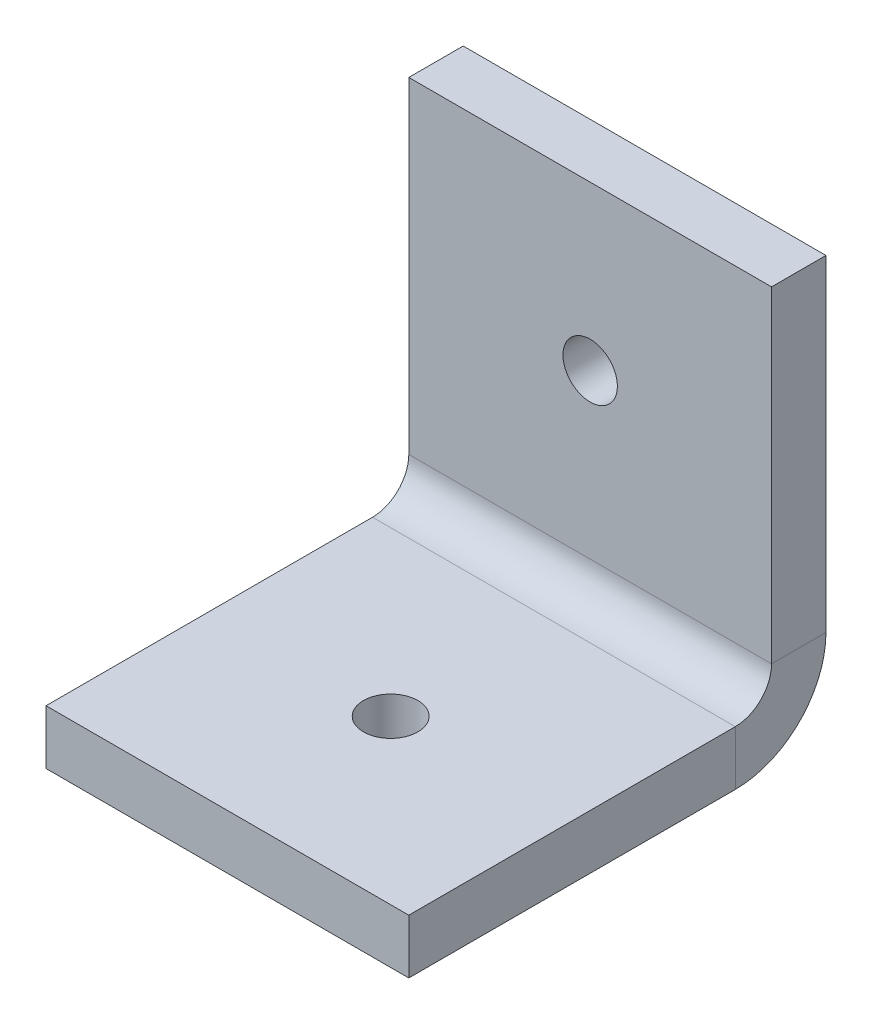
ISO-10303-21;
HEADER;
FILE_DESCRIPTION(('STEP AP214'),'2;1');
FILE_NAME('part.step','',(''),(''),'','','');
FILE_SCHEMA(('AUTOMOTIVE_DESIGN { 1 0 10303 214 1 1 1 1 }'));
ENDSEC;
DATA;
#1=APPLICATION_CONTEXT('core data for automotive mechanical design processes');
#2=APPLICATION_PROTOCOL_DEFINITION('international standard','automotive_design',2000,#1);
#3=PRODUCT_CONTEXT('',#1,'mechanical');
#4=PRODUCT('Part','Part','',(#3));
#5=PRODUCT_RELATED_PRODUCT_CATEGORY('part','',(#4));
#6=PRODUCT_DEFINITION_FORMATION('','',#4);
#7=PRODUCT_DEFINITION_CONTEXT('part definition',#1,'design');
#8=PRODUCT_DEFINITION('design','',#6,#7);
#9=PRODUCT_DEFINITION_SHAPE('','',#8);
#10=(LENGTH_UNIT() NAMED_UNIT(*) SI_UNIT(.MILLI.,.METRE.));
#11=(NAMED_UNIT(*) PLANE_ANGLE_UNIT() SI_UNIT($,.RADIAN.));
#12=(NAMED_UNIT(*) SI_UNIT($,.STERADIAN.) SOLID_ANGLE_UNIT());
#13=UNCERTAINTY_MEASURE_WITH_UNIT(LENGTH_MEASURE(1.E-05),#10,'distance_accuracy_value','');
#14=(GEOMETRIC_REPRESENTATION_CONTEXT(3) GLOBAL_UNCERTAINTY_ASSIGNED_CONTEXT((#13)) GLOBAL_UNIT_ASSIGNED_CONTEXT((#10,
#11,#12)) REPRESENTATION_CONTEXT('',''));
#15=CARTESIAN_POINT('',(0.,0.,0.));
#16=DIRECTION('',(0.,0.,1.));
#17=DIRECTION('',(1.,0.,0.));
#18=AXIS2_PLACEMENT_3D('',#15,#16,#17);
#19=CARTESIAN_POINT('',(20.,2.,0.));
#20=DIRECTION('',(1.,0.,0.));
#21=DIRECTION('',(0.,0.,-1.));
#22=AXIS2_PLACEMENT_3D('',#19,#20,#21);
#23=PLANE('',#22);
#24=DIRECTION('',(0.,0.,-1.));
#25=VECTOR('',#24,1.);
#26=CARTESIAN_POINT('',(20.,2.,0.));
#27=LINE('',#26,#25);
#28=CARTESIAN_POINT('',(20.,2.,0.));
#29=VERTEX_POINT('',#28);
#30=CARTESIAN_POINT('',(20.,2.,-3.));
#31=VERTEX_POINT('',#30);
#32=EDGE_CURVE('E11',#29,#31,#27,.T.);
#33=ORIENTED_EDGE('',*,*,#32,.F.);
#34=CARTESIAN_POINT('',(20.,2.,2.));
#35=DIRECTION('',(1.,0.,0.));
#36=DIRECTION('',(0.,0.,-1.));
#37=AXIS2_PLACEMENT_3D('',#34,#35,#36);
#38=CIRCLE('',#37,2.);
#39=CARTESIAN_POINT('',(20.,0.,2.));
#40=VERTEX_POINT('',#39);
#41=EDGE_CURVE('E129',#29,#40,#38,.F.);
#42=ORIENTED_EDGE('',*,*,#41,.T.);
#43=DIRECTION('',(0.,1.,0.));
#44=VECTOR('',#43,1.);
#45=CARTESIAN_POINT('',(20.,-3.,2.));
#46=LINE('',#45,#44);
#47=CARTESIAN_POINT('',(20.,-3.,2.));
#48=VERTEX_POINT('',#47);
#49=EDGE_CURVE('E47',#48,#40,#46,.T.);
#50=ORIENTED_EDGE('',*,*,#49,.F.);
#51=CARTESIAN_POINT('',(20.,2.,2.));
#52=DIRECTION('',(1.,0.,0.));
#53=DIRECTION('',(0.,0.,-1.));
#54=AXIS2_PLACEMENT_3D('',#51,#52,#53);
#55=CIRCLE('',#54,5.);
#56=EDGE_CURVE('E136',#31,#48,#55,.F.);
#57=ORIENTED_EDGE('',*,*,#56,.F.);
#58=EDGE_LOOP('',(#33,#42,#50,#57));
#59=FACE_BOUND('',#58,.T.);
#60=ADVANCED_FACE('F39',(#59),#23,.T.);
#61=CARTESIAN_POINT('',(20.,-3.,2.));
#62=DIRECTION('',(1.,0.,0.));
#63=DIRECTION('',(0.,0.,-1.));
#64=AXIS2_PLACEMENT_3D('',#61,#62,#63);
#65=PLANE('',#64);
#66=DIRECTION('',(0.,-1.,0.));
#67=VECTOR('',#66,1.);
#68=CARTESIAN_POINT('',(20.,20.,0.));
#69=LINE('',#68,#67);
#70=CARTESIAN_POINT('',(20.,20.,0.));
#71=VERTEX_POINT('',#70);
#72=EDGE_CURVE('E124',#71,#29,#69,.T.);
#73=ORIENTED_EDGE('',*,*,#72,.T.);
#74=ORIENTED_EDGE('',*,*,#32,.T.);
#75=DIRECTION('',(0.,-1.,0.));
#76=VECTOR('',#75,1.);
#77=CARTESIAN_POINT('',(20.,20.,-3.));
#78=LINE('',#77,#76);
#79=CARTESIAN_POINT('',(20.,20.,-3.));
#80=VERTEX_POINT('',#79);
#81=EDGE_CURVE('E134',#80,#31,#78,.T.);
#82=ORIENTED_EDGE('',*,*,#81,.F.);
#83=DIRECTION('',(0.,0.,-1.));
#84=VECTOR('',#83,1.);
#85=CARTESIAN_POINT('',(20.,20.,0.));
#86=LINE('',#85,#84);
#87=EDGE_CURVE('E115',#71,#80,#86,.T.);
#88=ORIENTED_EDGE('',*,*,#87,.F.);
#89=EDGE_LOOP('',(#73,#74,#82,#88));
#90=FACE_BOUND('',#89,.T.);
#91=ADVANCED_FACE('F132',(#90),#65,.T.);
#92=CARTESIAN_POINT('',(0.,0.,2.));
#93=DIRECTION('',(-1.,0.,0.));
#94=DIRECTION('',(0.,0.,1.));
#95=AXIS2_PLACEMENT_3D('',#92,#93,#94);
#96=PLANE('',#95);
#97=DIRECTION('',(0.,-1.,0.));
#98=VECTOR('',#97,1.);
#99=CARTESIAN_POINT('',(0.,0.,2.));
#100=LINE('',#99,#98);
#101=CARTESIAN_POINT('',(0.,0.,2.));
#102=VERTEX_POINT('',#101);
#103=CARTESIAN_POINT('',(0.,-3.,2.));
#104=VERTEX_POINT('',#103);
#105=EDGE_CURVE('E90',#102,#104,#100,.T.);
#106=ORIENTED_EDGE('',*,*,#105,.F.);
#107=CARTESIAN_POINT('',(0.,2.,2.));
#108=DIRECTION('',(1.,0.,0.));
#109=DIRECTION('',(0.,0.,-1.));
#110=AXIS2_PLACEMENT_3D('',#107,#108,#109);
#111=CIRCLE('',#110,2.);
#112=CARTESIAN_POINT('',(0.,2.,0.));
#113=VERTEX_POINT('',#112);
#114=EDGE_CURVE('E159',#113,#102,#111,.F.);
#115=ORIENTED_EDGE('',*,*,#114,.F.);
#116=DIRECTION('',(0.,0.,1.));
#117=VECTOR('',#116,1.);
#118=CARTESIAN_POINT('',(0.,2.,-3.));
#119=LINE('',#118,#117);
#120=CARTESIAN_POINT('',(0.,2.,-3.));
#121=VERTEX_POINT('',#120);
#122=EDGE_CURVE('E83',#121,#113,#119,.T.);
#123=ORIENTED_EDGE('',*,*,#122,.F.);
#124=CARTESIAN_POINT('',(0.,2.,2.));
#125=DIRECTION('',(1.,0.,0.));
#126=DIRECTION('',(0.,0.,-1.));
#127=AXIS2_PLACEMENT_3D('',#124,#125,#126);
#128=CIRCLE('',#127,5.);
#129=EDGE_CURVE('E152',#121,#104,#128,.F.);
#130=ORIENTED_EDGE('',*,*,#129,.T.);
#131=EDGE_LOOP('',(#106,#115,#123,#130));
#132=FACE_BOUND('',#131,.T.);
#133=ADVANCED_FACE('F191',(#132),#96,.T.);
#134=CARTESIAN_POINT('',(0.,2.,-3.));
#135=DIRECTION('',(-1.,0.,0.));
#136=DIRECTION('',(0.,0.,1.));
#137=AXIS2_PLACEMENT_3D('',#134,#135,#136);
#138=PLANE('',#137);
#139=DIRECTION('',(0.,0.,1.));
#140=VECTOR('',#139,1.);
#141=CARTESIAN_POINT('',(0.,0.,0.));
#142=LINE('',#141,#140);
#143=CARTESIAN_POINT('',(0.,0.,20.));
#144=VERTEX_POINT('',#143);
#145=EDGE_CURVE('E142',#102,#144,#142,.T.);
#146=ORIENTED_EDGE('',*,*,#145,.F.);
#147=ORIENTED_EDGE('',*,*,#105,.T.);
#148=DIRECTION('',(0.,0.,-1.));
#149=VECTOR('',#148,1.);
#150=CARTESIAN_POINT('',(0.,-3.,0.));
#151=LINE('',#150,#149);
#152=CARTESIAN_POINT('',(0.,-3.,20.));
#153=VERTEX_POINT('',#152);
#154=EDGE_CURVE('E149',#104,#153,#151,.F.);
#155=ORIENTED_EDGE('',*,*,#154,.T.);
#156=DIRECTION('',(0.,1.,0.));
#157=VECTOR('',#156,1.);
#158=CARTESIAN_POINT('',(0.,-3.,20.));
#159=LINE('',#158,#157);
#160=EDGE_CURVE('E145',#153,#144,#159,.T.);
#161=ORIENTED_EDGE('',*,*,#160,.T.);
#162=EDGE_LOOP('',(#146,#147,#155,#161));
#163=FACE_BOUND('',#162,.T.);
#164=ADVANCED_FACE('F178',(#163),#138,.T.);
#165=CARTESIAN_POINT('',(20.,0.,0.));
#166=DIRECTION('',(0.,-1.,0.));
#167=DIRECTION('',(0.,0.,-1.));
#168=AXIS2_PLACEMENT_3D('',#165,#166,#167);
#169=PLANE('',#168);
#170=CARTESIAN_POINT('',(10.,0.,11.));
#171=DIRECTION('',(0.,-1.,0.));
#172=DIRECTION('',(0.,0.,-1.));
#173=AXIS2_PLACEMENT_3D('',#170,#171,#172);
#174=CIRCLE('',#173,1.5);
#175=CARTESIAN_POINT('',(10.,0.,9.5));
#176=VERTEX_POINT('',#175);
#177=EDGE_CURVE('E206',#176,#176,#174,.T.);
#178=ORIENTED_EDGE('',*,*,#177,.T.);
#179=EDGE_LOOP('',(#178));
#180=FACE_BOUND('',#179,.T.);
#181=ORIENTED_EDGE('',*,*,#145,.T.);
#182=DIRECTION('',(-1.,0.,0.));
#183=VECTOR('',#182,1.);
#184=CARTESIAN_POINT('',(20.,0.,20.));
#185=LINE('',#184,#183);
#186=CARTESIAN_POINT('',(20.,0.,20.));
#187=VERTEX_POINT('',#186);
#188=EDGE_CURVE('E173',#187,#144,#185,.T.);
#189=ORIENTED_EDGE('',*,*,#188,.F.);
#190=DIRECTION('',(0.,0.,1.));
#191=VECTOR('',#190,1.);
#192=CARTESIAN_POINT('',(20.,0.,0.));
#193=LINE('',#192,#191);
#194=EDGE_CURVE('E96',#40,#187,#193,.T.);
#195=ORIENTED_EDGE('',*,*,#194,.F.);
#196=DIRECTION('',(-1.,0.,0.));
#197=VECTOR('',#196,1.);
#198=CARTESIAN_POINT('',(20.,0.,2.));
#199=LINE('',#198,#197);
#200=EDGE_CURVE('E141',#40,#102,#199,.T.);
#201=ORIENTED_EDGE('',*,*,#200,.T.);
#202=EDGE_LOOP('',(#181,#189,#195,#201));
#203=FACE_BOUND('',#202,.T.);
#204=ADVANCED_FACE('F215',(#180,#203),#169,.F.);
#205=CARTESIAN_POINT('',(20.,-3.,20.));
#206=DIRECTION('',(0.,0.,1.));
#207=DIRECTION('',(1.,0.,0.));
#208=AXIS2_PLACEMENT_3D('',#205,#206,#207);
#209=PLANE('',#208);
#210=ORIENTED_EDGE('',*,*,#160,.F.);
#211=DIRECTION('',(-1.,0.,0.));
#212=VECTOR('',#211,1.);
#213=CARTESIAN_POINT('',(20.,-3.,20.));
#214=LINE('',#213,#212);
#215=CARTESIAN_POINT('',(20.,-3.,20.));
#216=VERTEX_POINT('',#215);
#217=EDGE_CURVE('E171',#216,#153,#214,.T.);
#218=ORIENTED_EDGE('',*,*,#217,.F.);
#219=DIRECTION('',(0.,1.,0.));
#220=VECTOR('',#219,1.);
#221=CARTESIAN_POINT('',(20.,-3.,20.));
#222=LINE('',#221,#220);
#223=EDGE_CURVE('E197',#216,#187,#222,.T.);
#224=ORIENTED_EDGE('',*,*,#223,.T.);
#225=ORIENTED_EDGE('',*,*,#188,.T.);
#226=EDGE_LOOP('',(#210,#218,#224,#225));
#227=FACE_BOUND('',#226,.T.);
#228=ADVANCED_FACE('F226',(#227),#209,.T.);
#229=CARTESIAN_POINT('',(20.,-3.,0.));
#230=DIRECTION('',(0.,-1.,0.));
#231=DIRECTION('',(0.,0.,-1.));
#232=AXIS2_PLACEMENT_3D('',#229,#230,#231);
#233=PLANE('',#232);
#234=CARTESIAN_POINT('',(10.,-3.,11.));
#235=DIRECTION('',(0.,-1.,0.));
#236=DIRECTION('',(0.,0.,-1.));
#237=AXIS2_PLACEMENT_3D('',#234,#235,#236);
#238=CIRCLE('',#237,1.5);
#239=CARTESIAN_POINT('',(10.,-3.,9.5));
#240=VERTEX_POINT('',#239);
#241=EDGE_CURVE('E209',#240,#240,#238,.T.);
#242=ORIENTED_EDGE('',*,*,#241,.F.);
#243=EDGE_LOOP('',(#242));
#244=FACE_BOUND('',#243,.T.);
#245=ORIENTED_EDGE('',*,*,#154,.F.);
#246=DIRECTION('',(-1.,0.,0.));
#247=VECTOR('',#246,1.);
#248=CARTESIAN_POINT('',(20.,-3.,2.));
#249=LINE('',#248,#247);
#250=EDGE_CURVE('E168',#48,#104,#249,.T.);
#251=ORIENTED_EDGE('',*,*,#250,.F.);
#252=DIRECTION('',(0.,0.,-1.));
#253=VECTOR('',#252,1.);
#254=CARTESIAN_POINT('',(20.,-3.,0.));
#255=LINE('',#254,#253);
#256=EDGE_CURVE('E196',#48,#216,#255,.F.);
#257=ORIENTED_EDGE('',*,*,#256,.T.);
#258=ORIENTED_EDGE('',*,*,#217,.T.);
#259=EDGE_LOOP('',(#245,#251,#257,#258));
#260=FACE_BOUND('',#259,.T.);
#261=ADVANCED_FACE('F189',(#244,#260),#233,.T.);
#262=CARTESIAN_POINT('',(20.,2.,2.));
#263=DIRECTION('',(-1.,0.,0.));
#264=DIRECTION('',(0.,0.,1.));
#265=AXIS2_PLACEMENT_3D('',#262,#263,#264);
#266=CYLINDRICAL_SURFACE('',#265,5.);
#267=ORIENTED_EDGE('',*,*,#129,.F.);
#268=DIRECTION('',(-1.,0.,0.));
#269=VECTOR('',#268,1.);
#270=CARTESIAN_POINT('',(20.,2.,-3.));
#271=LINE('',#270,#269);
#272=EDGE_CURVE('E165',#31,#121,#271,.T.);
#273=ORIENTED_EDGE('',*,*,#272,.F.);
#274=ORIENTED_EDGE('',*,*,#56,.T.);
#275=ORIENTED_EDGE('',*,*,#250,.T.);
#276=EDGE_LOOP('',(#267,#273,#274,#275));
#277=FACE_BOUND('',#276,.T.);
#278=ADVANCED_FACE('F184',(#277),#266,.T.);
#279=CARTESIAN_POINT('',(20.,20.,-3.));
#280=DIRECTION('',(0.,0.,-1.));
#281=DIRECTION('',(0.,1.,0.));
#282=AXIS2_PLACEMENT_3D('',#279,#280,#281);
#283=PLANE('',#282);
#284=CARTESIAN_POINT('',(10.,11.,-3.));
#285=DIRECTION('',(0.,0.,-1.));
#286=DIRECTION('',(0.,1.,0.));
#287=AXIS2_PLACEMENT_3D('',#284,#285,#286);
#288=CIRCLE('',#287,1.5);
#289=CARTESIAN_POINT('',(10.,12.5,-3.));
#290=VERTEX_POINT('',#289);
#291=EDGE_CURVE('E203',#290,#290,#288,.T.);
#292=ORIENTED_EDGE('',*,*,#291,.F.);
#293=EDGE_LOOP('',(#292));
#294=FACE_BOUND('',#293,.T.);
#295=DIRECTION('',(0.,-1.,0.));
#296=VECTOR('',#295,1.);
#297=CARTESIAN_POINT('',(0.,20.,-3.));
#298=LINE('',#297,#296);
#299=CARTESIAN_POINT('',(0.,20.,-3.));
#300=VERTEX_POINT('',#299);
#301=EDGE_CURVE('E154',#300,#121,#298,.T.);
#302=ORIENTED_EDGE('',*,*,#301,.F.);
#303=DIRECTION('',(-1.,0.,0.));
#304=VECTOR('',#303,1.);
#305=CARTESIAN_POINT('',(20.,20.,-3.));
#306=LINE('',#305,#304);
#307=EDGE_CURVE('E119',#80,#300,#306,.T.);
#308=ORIENTED_EDGE('',*,*,#307,.F.);
#309=ORIENTED_EDGE('',*,*,#81,.T.);
#310=ORIENTED_EDGE('',*,*,#272,.T.);
#311=EDGE_LOOP('',(#302,#308,#309,#310));
#312=FACE_BOUND('',#311,.T.);
#313=ADVANCED_FACE('F194',(#294,#312),#283,.T.);
#314=CARTESIAN_POINT('',(20.,20.,0.));
#315=DIRECTION('',(0.,1.,0.));
#316=DIRECTION('',(0.,0.,1.));
#317=AXIS2_PLACEMENT_3D('',#314,#315,#316);
#318=PLANE('',#317);
#319=DIRECTION('',(0.,0.,-1.));
#320=VECTOR('',#319,1.);
#321=CARTESIAN_POINT('',(0.,20.,0.));
#322=LINE('',#321,#320);
#323=CARTESIAN_POINT('',(0.,20.,0.));
#324=VERTEX_POINT('',#323);
#325=EDGE_CURVE('E117',#324,#300,#322,.T.);
#326=ORIENTED_EDGE('',*,*,#325,.F.);
#327=DIRECTION('',(-1.,0.,0.));
#328=VECTOR('',#327,1.);
#329=CARTESIAN_POINT('',(20.,20.,0.));
#330=LINE('',#329,#328);
#331=EDGE_CURVE('E111',#71,#324,#330,.T.);
#332=ORIENTED_EDGE('',*,*,#331,.F.);
#333=ORIENTED_EDGE('',*,*,#87,.T.);
#334=ORIENTED_EDGE('',*,*,#307,.T.);
#335=EDGE_LOOP('',(#326,#332,#333,#334));
#336=FACE_BOUND('',#335,.T.);
#337=ADVANCED_FACE('F113',(#336),#318,.T.);
#338=CARTESIAN_POINT('',(20.,20.,0.));
#339=DIRECTION('',(0.,0.,-1.));
#340=DIRECTION('',(0.,1.,0.));
#341=AXIS2_PLACEMENT_3D('',#338,#339,#340);
#342=PLANE('',#341);
#343=CARTESIAN_POINT('',(10.,11.,0.));
#344=DIRECTION('',(0.,0.,-1.));
#345=DIRECTION('',(0.,1.,0.));
#346=AXIS2_PLACEMENT_3D('',#343,#344,#345);
#347=CIRCLE('',#346,1.5);
#348=CARTESIAN_POINT('',(10.,12.5,0.));
#349=VERTEX_POINT('',#348);
#350=EDGE_CURVE('E146',#349,#349,#347,.T.);
#351=ORIENTED_EDGE('',*,*,#350,.T.);
#352=EDGE_LOOP('',(#351));
#353=FACE_BOUND('',#352,.T.);
#354=DIRECTION('',(0.,-1.,0.));
#355=VECTOR('',#354,1.);
#356=CARTESIAN_POINT('',(0.,20.,0.));
#357=LINE('',#356,#355);
#358=EDGE_CURVE('E157',#324,#113,#357,.T.);
#359=ORIENTED_EDGE('',*,*,#358,.T.);
#360=DIRECTION('',(-1.,0.,0.));
#361=VECTOR('',#360,1.);
#362=CARTESIAN_POINT('',(20.,2.,0.));
#363=LINE('',#362,#361);
#364=EDGE_CURVE('E120',#29,#113,#363,.T.);
#365=ORIENTED_EDGE('',*,*,#364,.F.);
#366=ORIENTED_EDGE('',*,*,#72,.F.);
#367=ORIENTED_EDGE('',*,*,#331,.T.);
#368=EDGE_LOOP('',(#359,#365,#366,#367));
#369=FACE_BOUND('',#368,.T.);
#370=ADVANCED_FACE('F125',(#353,#369),#342,.F.);
#371=CARTESIAN_POINT('',(20.,2.,2.));
#372=DIRECTION('',(-1.,0.,0.));
#373=DIRECTION('',(0.,0.,1.));
#374=AXIS2_PLACEMENT_3D('',#371,#372,#373);
#375=CYLINDRICAL_SURFACE('',#374,2.);
#376=ORIENTED_EDGE('',*,*,#114,.T.);
#377=ORIENTED_EDGE('',*,*,#200,.F.);
#378=ORIENTED_EDGE('',*,*,#41,.F.);
#379=ORIENTED_EDGE('',*,*,#364,.T.);
#380=EDGE_LOOP('',(#376,#377,#378,#379));
#381=FACE_BOUND('',#380,.T.);
#382=ADVANCED_FACE('F286',(#381),#375,.F.);
#383=CARTESIAN_POINT('',(20.,2.,2.));
#384=DIRECTION('',(1.,0.,0.));
#385=DIRECTION('',(0.,0.,-1.));
#386=AXIS2_PLACEMENT_3D('',#383,#384,#385);
#387=PLANE('',#386);
#388=ORIENTED_EDGE('',*,*,#194,.T.);
#389=ORIENTED_EDGE('',*,*,#223,.F.);
#390=ORIENTED_EDGE('',*,*,#256,.F.);
#391=ORIENTED_EDGE('',*,*,#49,.T.);
#392=EDGE_LOOP('',(#388,#389,#390,#391));
#393=FACE_BOUND('',#392,.T.);
#394=ADVANCED_FACE('F291',(#393),#387,.T.);
#395=CARTESIAN_POINT('',(0.,2.,2.));
#396=DIRECTION('',(1.,0.,0.));
#397=DIRECTION('',(0.,0.,-1.));
#398=AXIS2_PLACEMENT_3D('',#395,#396,#397);
#399=PLANE('',#398);
#400=ORIENTED_EDGE('',*,*,#301,.T.);
#401=ORIENTED_EDGE('',*,*,#122,.T.);
#402=ORIENTED_EDGE('',*,*,#358,.F.);
#403=ORIENTED_EDGE('',*,*,#325,.T.);
#404=EDGE_LOOP('',(#400,#401,#402,#403));
#405=FACE_BOUND('',#404,.T.);
#406=ADVANCED_FACE('F302',(#405),#399,.F.);
#407=CARTESIAN_POINT('',(10.,11.,0.));
#408=DIRECTION('',(0.,0.,-1.));
#409=DIRECTION('',(0.,1.,0.));
#410=AXIS2_PLACEMENT_3D('',#407,#408,#409);
#411=CYLINDRICAL_SURFACE('',#410,1.5);
#412=ORIENTED_EDGE('',*,*,#350,.F.);
#413=EDGE_LOOP('',(#412));
#414=FACE_BOUND('',#413,.T.);
#415=ORIENTED_EDGE('',*,*,#291,.T.);
#416=EDGE_LOOP('',(#415));
#417=FACE_BOUND('',#416,.T.);
#418=ADVANCED_FACE('F221',(#414,#417),#411,.F.);
#419=CARTESIAN_POINT('',(10.,0.,11.));
#420=DIRECTION('',(0.,-1.,0.));
#421=DIRECTION('',(0.,0.,-1.));
#422=AXIS2_PLACEMENT_3D('',#419,#420,#421);
#423=CYLINDRICAL_SURFACE('',#422,1.5);
#424=ORIENTED_EDGE('',*,*,#177,.F.);
#425=EDGE_LOOP('',(#424));
#426=FACE_BOUND('',#425,.T.);
#427=ORIENTED_EDGE('',*,*,#241,.T.);
#428=EDGE_LOOP('',(#427));
#429=FACE_BOUND('',#428,.T.);
#430=ADVANCED_FACE('F218',(#426,#429),#423,.F.);
#431=CLOSED_SHELL('',(#60,#91,#133,#164,#204,#228,#261,#278,#313,#337,#370,#382,#394,#406,#418,#430));
#432=MANIFOLD_SOLID_BREP('B2',#431);
#433=ADVANCED_BREP_SHAPE_REPRESENTATION('',(#18,#432),#14);
#434=SHAPE_DEFINITION_REPRESENTATION(#9,#433);
ENDSEC;
END-ISO-10303-21;
